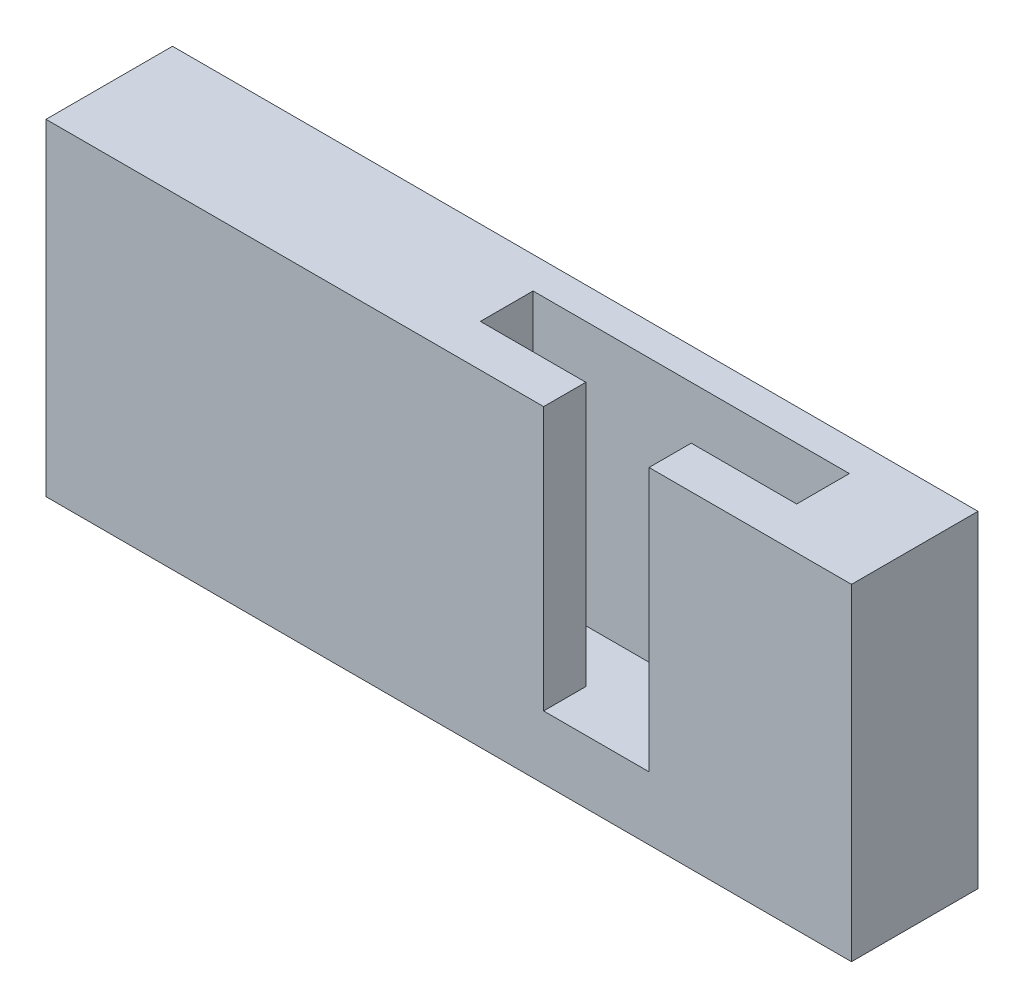
ISO-10303-21;
HEADER;
FILE_DESCRIPTION(('STEP AP214'),'2;1');
FILE_NAME('part.step','',(''),(''),'','','');
FILE_SCHEMA(('AUTOMOTIVE_DESIGN { 1 0 10303 214 1 1 1 1 }'));
ENDSEC;
DATA;
#1=APPLICATION_CONTEXT('core data for automotive mechanical design processes');
#2=APPLICATION_PROTOCOL_DEFINITION('international standard','automotive_design',2000,#1);
#3=PRODUCT_CONTEXT('',#1,'mechanical');
#4=PRODUCT('Part','Part','',(#3));
#5=PRODUCT_RELATED_PRODUCT_CATEGORY('part','',(#4));
#6=PRODUCT_DEFINITION_FORMATION('','',#4);
#7=PRODUCT_DEFINITION_CONTEXT('part definition',#1,'design');
#8=PRODUCT_DEFINITION('design','',#6,#7);
#9=PRODUCT_DEFINITION_SHAPE('','',#8);
#10=(LENGTH_UNIT() NAMED_UNIT(*) SI_UNIT(.MILLI.,.METRE.));
#11=(NAMED_UNIT(*) PLANE_ANGLE_UNIT() SI_UNIT($,.RADIAN.));
#12=(NAMED_UNIT(*) SI_UNIT($,.STERADIAN.) SOLID_ANGLE_UNIT());
#13=UNCERTAINTY_MEASURE_WITH_UNIT(LENGTH_MEASURE(1.E-05),#10,'distance_accuracy_value','');
#14=(GEOMETRIC_REPRESENTATION_CONTEXT(3) GLOBAL_UNCERTAINTY_ASSIGNED_CONTEXT((#13)) GLOBAL_UNIT_ASSIGNED_CONTEXT((#10,
#11,#12)) REPRESENTATION_CONTEXT('',''));
#15=CARTESIAN_POINT('',(0.,0.,0.));
#16=DIRECTION('',(0.,0.,1.));
#17=DIRECTION('',(1.,0.,0.));
#18=AXIS2_PLACEMENT_3D('',#15,#16,#17);
#19=CARTESIAN_POINT('',(0.,15.5,-6.));
#20=DIRECTION('',(0.,1.,0.));
#21=DIRECTION('',(0.,0.,1.));
#22=AXIS2_PLACEMENT_3D('',#19,#20,#21);
#23=PLANE('',#22);
#24=DIRECTION('',(-1.,0.,0.));
#25=VECTOR('',#24,1.);
#26=CARTESIAN_POINT('',(0.,15.5,-6.));
#27=LINE('',#26,#25);
#28=CARTESIAN_POINT('',(38.6,15.5,-6.));
#29=VERTEX_POINT('',#28);
#30=CARTESIAN_POINT('',(0.4,15.5,-6.));
#31=VERTEX_POINT('',#30);
#32=EDGE_CURVE('E138',#29,#31,#27,.T.);
#33=ORIENTED_EDGE('',*,*,#32,.T.);
#34=DIRECTION('',(0.,0.,1.));
#35=VECTOR('',#34,1.);
#36=CARTESIAN_POINT('',(0.4,15.5,-6.));
#37=LINE('',#36,#35);
#38=CARTESIAN_POINT('',(0.4,15.5,0.));
#39=VERTEX_POINT('',#38);
#40=EDGE_CURVE('E127',#31,#39,#37,.T.);
#41=ORIENTED_EDGE('',*,*,#40,.T.);
#42=DIRECTION('',(-1.,0.,0.));
#43=VECTOR('',#42,1.);
#44=CARTESIAN_POINT('',(0.,15.5,0.));
#45=LINE('',#44,#43);
#46=CARTESIAN_POINT('',(24.,15.5,0.));
#47=VERTEX_POINT('',#46);
#48=EDGE_CURVE('E136',#47,#39,#45,.T.);
#49=ORIENTED_EDGE('',*,*,#48,.F.);
#50=DIRECTION('',(0.,0.,1.));
#51=VECTOR('',#50,1.);
#52=CARTESIAN_POINT('',(24.,15.5,0.));
#53=LINE('',#52,#51);
#54=CARTESIAN_POINT('',(24.,15.5,-2.));
#55=VERTEX_POINT('',#54);
#56=EDGE_CURVE('E195',#55,#47,#53,.T.);
#57=ORIENTED_EDGE('',*,*,#56,.F.);
#58=DIRECTION('',(1.,0.,0.));
#59=VECTOR('',#58,1.);
#60=CARTESIAN_POINT('',(24.,15.5,-2.));
#61=LINE('',#60,#59);
#62=CARTESIAN_POINT('',(19.,15.5,-2.));
#63=VERTEX_POINT('',#62);
#64=EDGE_CURVE('E212',#63,#55,#61,.T.);
#65=ORIENTED_EDGE('',*,*,#64,.F.);
#66=DIRECTION('',(0.,0.,1.));
#67=VECTOR('',#66,1.);
#68=CARTESIAN_POINT('',(19.,15.5,-2.));
#69=LINE('',#68,#67);
#70=CARTESIAN_POINT('',(19.,15.5,-4.5));
#71=VERTEX_POINT('',#70);
#72=EDGE_CURVE('E209',#71,#63,#69,.T.);
#73=ORIENTED_EDGE('',*,*,#72,.F.);
#74=DIRECTION('',(-1.,0.,0.));
#75=VECTOR('',#74,1.);
#76=CARTESIAN_POINT('',(19.,15.5,-4.5));
#77=LINE('',#76,#75);
#78=CARTESIAN_POINT('',(34.,15.5,-4.5));
#79=VERTEX_POINT('',#78);
#80=EDGE_CURVE('E206',#79,#71,#77,.T.);
#81=ORIENTED_EDGE('',*,*,#80,.F.);
#82=DIRECTION('',(0.,0.,-1.));
#83=VECTOR('',#82,1.);
#84=CARTESIAN_POINT('',(34.,15.5,-4.5));
#85=LINE('',#84,#83);
#86=CARTESIAN_POINT('',(34.,15.5,-2.));
#87=VERTEX_POINT('',#86);
#88=EDGE_CURVE('E203',#87,#79,#85,.T.);
#89=ORIENTED_EDGE('',*,*,#88,.F.);
#90=DIRECTION('',(1.,0.,0.));
#91=VECTOR('',#90,1.);
#92=CARTESIAN_POINT('',(34.,15.5,-2.));
#93=LINE('',#92,#91);
#94=CARTESIAN_POINT('',(29.,15.5,-2.));
#95=VERTEX_POINT('',#94);
#96=EDGE_CURVE('E199',#95,#87,#93,.T.);
#97=ORIENTED_EDGE('',*,*,#96,.F.);
#98=DIRECTION('',(0.,0.,-1.));
#99=VECTOR('',#98,1.);
#100=CARTESIAN_POINT('',(29.,15.5,-2.));
#101=LINE('',#100,#99);
#102=CARTESIAN_POINT('',(29.,15.5,0.));
#103=VERTEX_POINT('',#102);
#104=EDGE_CURVE('E196',#103,#95,#101,.T.);
#105=ORIENTED_EDGE('',*,*,#104,.F.);
#106=CARTESIAN_POINT('',(38.6,15.5,0.));
#107=VERTEX_POINT('',#106);
#108=EDGE_CURVE('E145',#107,#103,#45,.T.);
#109=ORIENTED_EDGE('',*,*,#108,.F.);
#110=DIRECTION('',(0.,0.,-1.));
#111=VECTOR('',#110,1.);
#112=CARTESIAN_POINT('',(38.6,15.5,-6.));
#113=LINE('',#112,#111);
#114=EDGE_CURVE('E61',#107,#29,#113,.T.);
#115=ORIENTED_EDGE('',*,*,#114,.T.);
#116=EDGE_LOOP('',(#33,#41,#49,#57,#65,#73,#81,#89,#97,#105,#109,#115));
#117=FACE_BOUND('',#116,.T.);
#118=ADVANCED_FACE('F39',(#117),#23,.T.);
#119=CARTESIAN_POINT('',(0.,0.,-6.));
#120=DIRECTION('',(0.,-1.,0.));
#121=DIRECTION('',(0.,0.,-1.));
#122=AXIS2_PLACEMENT_3D('',#119,#120,#121);
#123=PLANE('',#122);
#124=DIRECTION('',(1.,0.,0.));
#125=VECTOR('',#124,1.);
#126=CARTESIAN_POINT('',(0.,0.,0.));
#127=LINE('',#126,#125);
#128=CARTESIAN_POINT('',(0.4,0.,0.));
#129=VERTEX_POINT('',#128);
#130=CARTESIAN_POINT('',(38.6,0.,0.));
#131=VERTEX_POINT('',#130);
#132=EDGE_CURVE('E146',#129,#131,#127,.T.);
#133=ORIENTED_EDGE('',*,*,#132,.F.);
#134=DIRECTION('',(0.,0.,-1.));
#135=VECTOR('',#134,1.);
#136=CARTESIAN_POINT('',(0.4,0.,-6.));
#137=LINE('',#136,#135);
#138=CARTESIAN_POINT('',(0.4,0.,-6.));
#139=VERTEX_POINT('',#138);
#140=EDGE_CURVE('E53',#129,#139,#137,.T.);
#141=ORIENTED_EDGE('',*,*,#140,.T.);
#142=DIRECTION('',(1.,0.,0.));
#143=VECTOR('',#142,1.);
#144=CARTESIAN_POINT('',(0.,0.,-6.));
#145=LINE('',#144,#143);
#146=CARTESIAN_POINT('',(38.6,0.,-6.));
#147=VERTEX_POINT('',#146);
#148=EDGE_CURVE('E148',#139,#147,#145,.T.);
#149=ORIENTED_EDGE('',*,*,#148,.T.);
#150=DIRECTION('',(0.,0.,1.));
#151=VECTOR('',#150,1.);
#152=CARTESIAN_POINT('',(38.6,0.,-6.));
#153=LINE('',#152,#151);
#154=EDGE_CURVE('E219',#147,#131,#153,.T.);
#155=ORIENTED_EDGE('',*,*,#154,.T.);
#156=EDGE_LOOP('',(#133,#141,#149,#155));
#157=FACE_BOUND('',#156,.T.);
#158=ADVANCED_FACE('F41',(#157),#123,.T.);
#159=CARTESIAN_POINT('',(0.,0.,-6.));
#160=DIRECTION('',(0.,0.,-1.));
#161=DIRECTION('',(-1.,0.,0.));
#162=AXIS2_PLACEMENT_3D('',#159,#160,#161);
#163=PLANE('',#162);
#164=ORIENTED_EDGE('',*,*,#148,.F.);
#165=DIRECTION('',(0.,1.,0.));
#166=VECTOR('',#165,1.);
#167=CARTESIAN_POINT('',(0.4,0.,-6.));
#168=LINE('',#167,#166);
#169=EDGE_CURVE('E139',#139,#31,#168,.T.);
#170=ORIENTED_EDGE('',*,*,#169,.T.);
#171=ORIENTED_EDGE('',*,*,#32,.F.);
#172=DIRECTION('',(0.,-1.,0.));
#173=VECTOR('',#172,1.);
#174=CARTESIAN_POINT('',(38.6,0.,-6.));
#175=LINE('',#174,#173);
#176=EDGE_CURVE('E200',#29,#147,#175,.T.);
#177=ORIENTED_EDGE('',*,*,#176,.T.);
#178=EDGE_LOOP('',(#164,#170,#171,#177));
#179=FACE_BOUND('',#178,.T.);
#180=ADVANCED_FACE('F225',(#179),#163,.T.);
#181=CARTESIAN_POINT('',(0.,0.,0.));
#182=DIRECTION('',(0.,0.,-1.));
#183=DIRECTION('',(-1.,0.,0.));
#184=AXIS2_PLACEMENT_3D('',#181,#182,#183);
#185=PLANE('',#184);
#186=DIRECTION('',(0.,1.,0.));
#187=VECTOR('',#186,1.);
#188=CARTESIAN_POINT('',(0.4,0.,0.));
#189=LINE('',#188,#187);
#190=EDGE_CURVE('E12',#129,#39,#189,.T.);
#191=ORIENTED_EDGE('',*,*,#190,.F.);
#192=ORIENTED_EDGE('',*,*,#132,.T.);
#193=DIRECTION('',(0.,-1.,0.));
#194=VECTOR('',#193,1.);
#195=CARTESIAN_POINT('',(38.6,0.,0.));
#196=LINE('',#195,#194);
#197=EDGE_CURVE('E47',#107,#131,#196,.T.);
#198=ORIENTED_EDGE('',*,*,#197,.F.);
#199=ORIENTED_EDGE('',*,*,#108,.T.);
#200=DIRECTION('',(0.,1.,0.));
#201=VECTOR('',#200,1.);
#202=CARTESIAN_POINT('',(29.,-15.6604597633658,0.));
#203=LINE('',#202,#201);
#204=CARTESIAN_POINT('',(29.,3.,0.));
#205=VERTEX_POINT('',#204);
#206=EDGE_CURVE('E149',#205,#103,#203,.T.);
#207=ORIENTED_EDGE('',*,*,#206,.F.);
#208=DIRECTION('',(1.,0.,0.));
#209=VECTOR('',#208,1.);
#210=CARTESIAN_POINT('',(29.,3.,0.));
#211=LINE('',#210,#209);
#212=CARTESIAN_POINT('',(24.,3.,0.));
#213=VERTEX_POINT('',#212);
#214=EDGE_CURVE('E158',#213,#205,#211,.T.);
#215=ORIENTED_EDGE('',*,*,#214,.F.);
#216=DIRECTION('',(0.,1.,0.));
#217=VECTOR('',#216,1.);
#218=CARTESIAN_POINT('',(24.,-15.6604597633658,0.));
#219=LINE('',#218,#217);
#220=EDGE_CURVE('E144',#213,#47,#219,.T.);
#221=ORIENTED_EDGE('',*,*,#220,.T.);
#222=ORIENTED_EDGE('',*,*,#48,.T.);
#223=EDGE_LOOP('',(#191,#192,#198,#199,#207,#215,#221,#222));
#224=FACE_BOUND('',#223,.T.);
#225=ADVANCED_FACE('F142',(#224),#185,.F.);
#226=CARTESIAN_POINT('',(0.,3.,-6.));
#227=DIRECTION('',(0.,-1.,0.));
#228=DIRECTION('',(0.,0.,-1.));
#229=AXIS2_PLACEMENT_3D('',#226,#227,#228);
#230=PLANE('',#229);
#231=ORIENTED_EDGE('',*,*,#214,.T.);
#232=DIRECTION('',(0.,0.,-1.));
#233=VECTOR('',#232,1.);
#234=CARTESIAN_POINT('',(29.,3.,-2.));
#235=LINE('',#234,#233);
#236=CARTESIAN_POINT('',(29.,3.,-2.));
#237=VERTEX_POINT('',#236);
#238=EDGE_CURVE('E162',#205,#237,#235,.T.);
#239=ORIENTED_EDGE('',*,*,#238,.T.);
#240=DIRECTION('',(1.,0.,0.));
#241=VECTOR('',#240,1.);
#242=CARTESIAN_POINT('',(34.,3.,-2.));
#243=LINE('',#242,#241);
#244=CARTESIAN_POINT('',(34.,3.,-2.));
#245=VERTEX_POINT('',#244);
#246=EDGE_CURVE('E161',#237,#245,#243,.T.);
#247=ORIENTED_EDGE('',*,*,#246,.T.);
#248=DIRECTION('',(0.,0.,-1.));
#249=VECTOR('',#248,1.);
#250=CARTESIAN_POINT('',(34.,3.,-4.5));
#251=LINE('',#250,#249);
#252=CARTESIAN_POINT('',(34.,3.,-4.5));
#253=VERTEX_POINT('',#252);
#254=EDGE_CURVE('E165',#245,#253,#251,.T.);
#255=ORIENTED_EDGE('',*,*,#254,.T.);
#256=DIRECTION('',(-1.,0.,0.));
#257=VECTOR('',#256,1.);
#258=CARTESIAN_POINT('',(19.,3.,-4.5));
#259=LINE('',#258,#257);
#260=CARTESIAN_POINT('',(19.,3.,-4.5));
#261=VERTEX_POINT('',#260);
#262=EDGE_CURVE('E168',#253,#261,#259,.T.);
#263=ORIENTED_EDGE('',*,*,#262,.T.);
#264=DIRECTION('',(0.,0.,1.));
#265=VECTOR('',#264,1.);
#266=CARTESIAN_POINT('',(19.,3.,-2.));
#267=LINE('',#266,#265);
#268=CARTESIAN_POINT('',(19.,3.,-2.));
#269=VERTEX_POINT('',#268);
#270=EDGE_CURVE('E171',#261,#269,#267,.T.);
#271=ORIENTED_EDGE('',*,*,#270,.T.);
#272=DIRECTION('',(1.,0.,0.));
#273=VECTOR('',#272,1.);
#274=CARTESIAN_POINT('',(24.,3.,-2.));
#275=LINE('',#274,#273);
#276=CARTESIAN_POINT('',(24.,3.,-2.));
#277=VERTEX_POINT('',#276);
#278=EDGE_CURVE('E174',#269,#277,#275,.T.);
#279=ORIENTED_EDGE('',*,*,#278,.T.);
#280=DIRECTION('',(0.,0.,1.));
#281=VECTOR('',#280,1.);
#282=CARTESIAN_POINT('',(24.,3.,0.));
#283=LINE('',#282,#281);
#284=EDGE_CURVE('E177',#277,#213,#283,.T.);
#285=ORIENTED_EDGE('',*,*,#284,.T.);
#286=EDGE_LOOP('',(#231,#239,#247,#255,#263,#271,#279,#285));
#287=FACE_BOUND('',#286,.T.);
#288=ADVANCED_FACE('F235',(#287),#230,.F.);
#289=CARTESIAN_POINT('',(29.,-15.6604597633658,-2.));
#290=DIRECTION('',(1.,0.,0.));
#291=DIRECTION('',(0.,0.,-1.));
#292=AXIS2_PLACEMENT_3D('',#289,#290,#291);
#293=PLANE('',#292);
#294=ORIENTED_EDGE('',*,*,#206,.T.);
#295=ORIENTED_EDGE('',*,*,#104,.T.);
#296=DIRECTION('',(0.,1.,0.));
#297=VECTOR('',#296,1.);
#298=CARTESIAN_POINT('',(29.,-15.6604597633658,-2.));
#299=LINE('',#298,#297);
#300=EDGE_CURVE('E159',#237,#95,#299,.T.);
#301=ORIENTED_EDGE('',*,*,#300,.F.);
#302=ORIENTED_EDGE('',*,*,#238,.F.);
#303=EDGE_LOOP('',(#294,#295,#301,#302));
#304=FACE_BOUND('',#303,.T.);
#305=ADVANCED_FACE('F232',(#304),#293,.F.);
#306=CARTESIAN_POINT('',(34.,-15.6604597633658,-2.));
#307=DIRECTION('',(0.,0.,1.));
#308=DIRECTION('',(1.,0.,0.));
#309=AXIS2_PLACEMENT_3D('',#306,#307,#308);
#310=PLANE('',#309);
#311=ORIENTED_EDGE('',*,*,#300,.T.);
#312=ORIENTED_EDGE('',*,*,#96,.T.);
#313=DIRECTION('',(0.,1.,0.));
#314=VECTOR('',#313,1.);
#315=CARTESIAN_POINT('',(34.,-15.6604597633658,-2.));
#316=LINE('',#315,#314);
#317=EDGE_CURVE('E163',#245,#87,#316,.T.);
#318=ORIENTED_EDGE('',*,*,#317,.F.);
#319=ORIENTED_EDGE('',*,*,#246,.F.);
#320=EDGE_LOOP('',(#311,#312,#318,#319));
#321=FACE_BOUND('',#320,.T.);
#322=ADVANCED_FACE('F256',(#321),#310,.F.);
#323=CARTESIAN_POINT('',(34.,-15.6604597633658,-4.5));
#324=DIRECTION('',(1.,0.,0.));
#325=DIRECTION('',(0.,0.,-1.));
#326=AXIS2_PLACEMENT_3D('',#323,#324,#325);
#327=PLANE('',#326);
#328=ORIENTED_EDGE('',*,*,#317,.T.);
#329=ORIENTED_EDGE('',*,*,#88,.T.);
#330=DIRECTION('',(0.,1.,0.));
#331=VECTOR('',#330,1.);
#332=CARTESIAN_POINT('',(34.,-15.6604597633658,-4.5));
#333=LINE('',#332,#331);
#334=EDGE_CURVE('E166',#253,#79,#333,.T.);
#335=ORIENTED_EDGE('',*,*,#334,.F.);
#336=ORIENTED_EDGE('',*,*,#254,.F.);
#337=EDGE_LOOP('',(#328,#329,#335,#336));
#338=FACE_BOUND('',#337,.T.);
#339=ADVANCED_FACE('F253',(#338),#327,.F.);
#340=CARTESIAN_POINT('',(19.,-15.6604597633658,-4.5));
#341=DIRECTION('',(0.,0.,-1.));
#342=DIRECTION('',(-1.,0.,0.));
#343=AXIS2_PLACEMENT_3D('',#340,#341,#342);
#344=PLANE('',#343);
#345=ORIENTED_EDGE('',*,*,#334,.T.);
#346=ORIENTED_EDGE('',*,*,#80,.T.);
#347=DIRECTION('',(0.,1.,0.));
#348=VECTOR('',#347,1.);
#349=CARTESIAN_POINT('',(19.,-15.6604597633658,-4.5));
#350=LINE('',#349,#348);
#351=EDGE_CURVE('E169',#261,#71,#350,.T.);
#352=ORIENTED_EDGE('',*,*,#351,.F.);
#353=ORIENTED_EDGE('',*,*,#262,.F.);
#354=EDGE_LOOP('',(#345,#346,#352,#353));
#355=FACE_BOUND('',#354,.T.);
#356=ADVANCED_FACE('F250',(#355),#344,.F.);
#357=CARTESIAN_POINT('',(19.,-15.6604597633658,-2.));
#358=DIRECTION('',(-1.,0.,0.));
#359=DIRECTION('',(0.,0.,1.));
#360=AXIS2_PLACEMENT_3D('',#357,#358,#359);
#361=PLANE('',#360);
#362=ORIENTED_EDGE('',*,*,#351,.T.);
#363=ORIENTED_EDGE('',*,*,#72,.T.);
#364=DIRECTION('',(0.,1.,0.));
#365=VECTOR('',#364,1.);
#366=CARTESIAN_POINT('',(19.,-15.6604597633658,-2.));
#367=LINE('',#366,#365);
#368=EDGE_CURVE('E172',#269,#63,#367,.T.);
#369=ORIENTED_EDGE('',*,*,#368,.F.);
#370=ORIENTED_EDGE('',*,*,#270,.F.);
#371=EDGE_LOOP('',(#362,#363,#369,#370));
#372=FACE_BOUND('',#371,.T.);
#373=ADVANCED_FACE('F247',(#372),#361,.F.);
#374=CARTESIAN_POINT('',(24.,-15.6604597633658,-2.));
#375=DIRECTION('',(0.,0.,1.));
#376=DIRECTION('',(1.,0.,0.));
#377=AXIS2_PLACEMENT_3D('',#374,#375,#376);
#378=PLANE('',#377);
#379=ORIENTED_EDGE('',*,*,#368,.T.);
#380=ORIENTED_EDGE('',*,*,#64,.T.);
#381=DIRECTION('',(0.,1.,0.));
#382=VECTOR('',#381,1.);
#383=CARTESIAN_POINT('',(24.,-15.6604597633658,-2.));
#384=LINE('',#383,#382);
#385=EDGE_CURVE('E175',#277,#55,#384,.T.);
#386=ORIENTED_EDGE('',*,*,#385,.F.);
#387=ORIENTED_EDGE('',*,*,#278,.F.);
#388=EDGE_LOOP('',(#379,#380,#386,#387));
#389=FACE_BOUND('',#388,.T.);
#390=ADVANCED_FACE('F240',(#389),#378,.F.);
#391=CARTESIAN_POINT('',(24.,-15.6604597633658,0.));
#392=DIRECTION('',(-1.,0.,0.));
#393=DIRECTION('',(0.,0.,1.));
#394=AXIS2_PLACEMENT_3D('',#391,#392,#393);
#395=PLANE('',#394);
#396=ORIENTED_EDGE('',*,*,#385,.T.);
#397=ORIENTED_EDGE('',*,*,#56,.T.);
#398=ORIENTED_EDGE('',*,*,#220,.F.);
#399=ORIENTED_EDGE('',*,*,#284,.F.);
#400=EDGE_LOOP('',(#396,#397,#398,#399));
#401=FACE_BOUND('',#400,.T.);
#402=ADVANCED_FACE('F238',(#401),#395,.F.);
#403=CARTESIAN_POINT('',(38.6,0.,0.));
#404=DIRECTION('',(1.,0.,0.));
#405=DIRECTION('',(0.,0.,-1.));
#406=AXIS2_PLACEMENT_3D('',#403,#404,#405);
#407=PLANE('',#406);
#408=ORIENTED_EDGE('',*,*,#114,.F.);
#409=ORIENTED_EDGE('',*,*,#197,.T.);
#410=ORIENTED_EDGE('',*,*,#154,.F.);
#411=ORIENTED_EDGE('',*,*,#176,.F.);
#412=EDGE_LOOP('',(#408,#409,#410,#411));
#413=FACE_BOUND('',#412,.T.);
#414=ADVANCED_FACE('F226',(#413),#407,.T.);
#415=CARTESIAN_POINT('',(0.4,0.,0.));
#416=DIRECTION('',(-1.,0.,0.));
#417=DIRECTION('',(0.,0.,1.));
#418=AXIS2_PLACEMENT_3D('',#415,#416,#417);
#419=PLANE('',#418);
#420=ORIENTED_EDGE('',*,*,#140,.F.);
#421=ORIENTED_EDGE('',*,*,#190,.T.);
#422=ORIENTED_EDGE('',*,*,#40,.F.);
#423=ORIENTED_EDGE('',*,*,#169,.F.);
#424=EDGE_LOOP('',(#420,#421,#422,#423));
#425=FACE_BOUND('',#424,.T.);
#426=ADVANCED_FACE('F126',(#425),#419,.T.);
#427=CLOSED_SHELL('',(#118,#158,#180,#225,#288,#305,#322,#339,#356,#373,#390,#402,#414,#426));
#428=MANIFOLD_SOLID_BREP('B2',#427);
#429=ADVANCED_BREP_SHAPE_REPRESENTATION('',(#18,#428),#14);
#430=SHAPE_DEFINITION_REPRESENTATION(#9,#429);
ENDSEC;
END-ISO-10303-21;
